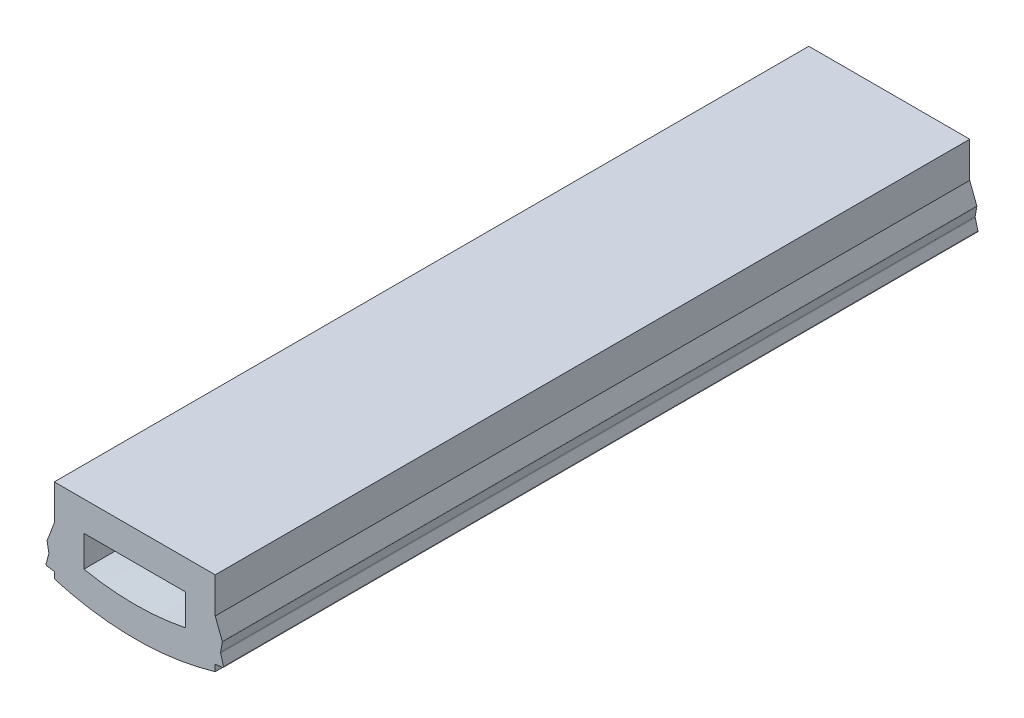
ISO-10303-21;
HEADER;
FILE_DESCRIPTION(('STEP AP214'),'2;1');
FILE_NAME('part.step','',(''),(''),'','','');
FILE_SCHEMA(('AUTOMOTIVE_DESIGN { 1 0 10303 214 1 1 1 1 }'));
ENDSEC;
DATA;
#1=APPLICATION_CONTEXT('core data for automotive mechanical design processes');
#2=APPLICATION_PROTOCOL_DEFINITION('international standard','automotive_design',2000,#1);
#3=PRODUCT_CONTEXT('',#1,'mechanical');
#4=PRODUCT('Part','Part','',(#3));
#5=PRODUCT_RELATED_PRODUCT_CATEGORY('part','',(#4));
#6=PRODUCT_DEFINITION_FORMATION('','',#4);
#7=PRODUCT_DEFINITION_CONTEXT('part definition',#1,'design');
#8=PRODUCT_DEFINITION('design','',#6,#7);
#9=PRODUCT_DEFINITION_SHAPE('','',#8);
#10=(LENGTH_UNIT() NAMED_UNIT(*) SI_UNIT(.MILLI.,.METRE.));
#11=(NAMED_UNIT(*) PLANE_ANGLE_UNIT() SI_UNIT($,.RADIAN.));
#12=(NAMED_UNIT(*) SI_UNIT($,.STERADIAN.) SOLID_ANGLE_UNIT());
#13=UNCERTAINTY_MEASURE_WITH_UNIT(LENGTH_MEASURE(1.E-05),#10,'distance_accuracy_value','');
#14=(GEOMETRIC_REPRESENTATION_CONTEXT(3) GLOBAL_UNCERTAINTY_ASSIGNED_CONTEXT((#13)) GLOBAL_UNIT_ASSIGNED_CONTEXT((#10,
#11,#12)) REPRESENTATION_CONTEXT('',''));
#15=CARTESIAN_POINT('',(0.,0.,0.));
#16=DIRECTION('',(0.,0.,1.));
#17=DIRECTION('',(1.,0.,0.));
#18=AXIS2_PLACEMENT_3D('',#15,#16,#17);
#19=CARTESIAN_POINT('',(-15.9576717718248,-92.1739103346942,-150.));
#20=DIRECTION('',(1.,0.,0.));
#21=DIRECTION('',(0.,0.,-1.));
#22=AXIS2_PLACEMENT_3D('',#19,#20,#21);
#23=PLANE('',#22);
#24=DIRECTION('',(0.,0.,-1.));
#25=VECTOR('',#24,1.);
#26=CARTESIAN_POINT('',(-15.9576717718248,-82.5706933548295,8.48348129526422));
#27=LINE('',#26,#25);
#28=CARTESIAN_POINT('',(-15.9576717718248,-82.5706933548295,0.));
#29=VERTEX_POINT('',#28);
#30=CARTESIAN_POINT('',(-15.9576717718248,-82.5706933548295,-150.));
#31=VERTEX_POINT('',#30);
#32=EDGE_CURVE('E247',#29,#31,#27,.T.);
#33=ORIENTED_EDGE('',*,*,#32,.F.);
#34=DIRECTION('',(0.,1.,0.));
#35=VECTOR('',#34,1.);
#36=CARTESIAN_POINT('',(-15.9576717718248,-92.1739103346942,0.));
#37=LINE('',#36,#35);
#38=CARTESIAN_POINT('',(-15.9576717718248,-75.4867347301291,0.));
#39=VERTEX_POINT('',#38);
#40=EDGE_CURVE('E454',#29,#39,#37,.T.);
#41=ORIENTED_EDGE('',*,*,#40,.T.);
#42=DIRECTION('',(0.,0.,1.));
#43=VECTOR('',#42,1.);
#44=CARTESIAN_POINT('',(-15.9576717718248,-75.4867347301291,-150.));
#45=LINE('',#44,#43);
#46=CARTESIAN_POINT('',(-15.9576717718248,-75.4867347301291,-150.));
#47=VERTEX_POINT('',#46);
#48=EDGE_CURVE('E50',#47,#39,#45,.T.);
#49=ORIENTED_EDGE('',*,*,#48,.F.);
#50=DIRECTION('',(0.,1.,0.));
#51=VECTOR('',#50,1.);
#52=CARTESIAN_POINT('',(-15.9576717718248,-92.1739103346942,-150.));
#53=LINE('',#52,#51);
#54=EDGE_CURVE('E456',#31,#47,#53,.T.);
#55=ORIENTED_EDGE('',*,*,#54,.F.);
#56=EDGE_LOOP('',(#33,#41,#49,#55));
#57=FACE_BOUND('',#56,.T.);
#58=ADVANCED_FACE('F41',(#57),#23,.F.);
#59=CARTESIAN_POINT('',(16.0423282281753,-75.4867347301291,-150.));
#60=DIRECTION('',(-1.,0.,0.));
#61=DIRECTION('',(0.,0.,1.));
#62=AXIS2_PLACEMENT_3D('',#59,#60,#61);
#63=PLANE('',#62);
#64=DIRECTION('',(0.,0.,-1.));
#65=VECTOR('',#64,1.);
#66=CARTESIAN_POINT('',(16.0423282281753,-90.8939103346942,8.48348129526422));
#67=LINE('',#66,#65);
#68=CARTESIAN_POINT('',(16.0423282281753,-90.8939103346943,0.));
#69=VERTEX_POINT('',#68);
#70=CARTESIAN_POINT('',(16.0423282281753,-90.8939103346942,-150.));
#71=VERTEX_POINT('',#70);
#72=EDGE_CURVE('E344',#69,#71,#67,.T.);
#73=ORIENTED_EDGE('',*,*,#72,.F.);
#74=DIRECTION('',(0.,-1.,0.));
#75=VECTOR('',#74,1.);
#76=CARTESIAN_POINT('',(16.0423282281753,-75.4867347301291,0.));
#77=LINE('',#76,#75);
#78=CARTESIAN_POINT('',(16.0423282281753,-92.1739103346944,0.));
#79=VERTEX_POINT('',#78);
#80=EDGE_CURVE('E475',#69,#79,#77,.T.);
#81=ORIENTED_EDGE('',*,*,#80,.T.);
#82=DIRECTION('',(0.,0.,1.));
#83=VECTOR('',#82,1.);
#84=CARTESIAN_POINT('',(16.0423282281753,-92.1739103346944,-150.));
#85=LINE('',#84,#83);
#86=CARTESIAN_POINT('',(16.0423282281753,-92.1739103346944,-150.));
#87=VERTEX_POINT('',#86);
#88=EDGE_CURVE('E481',#87,#79,#85,.T.);
#89=ORIENTED_EDGE('',*,*,#88,.F.);
#90=DIRECTION('',(0.,-1.,0.));
#91=VECTOR('',#90,1.);
#92=CARTESIAN_POINT('',(16.0423282281753,-75.4867347301291,-150.));
#93=LINE('',#92,#91);
#94=EDGE_CURVE('E496',#71,#87,#93,.T.);
#95=ORIENTED_EDGE('',*,*,#94,.F.);
#96=EDGE_LOOP('',(#73,#81,#89,#95));
#97=FACE_BOUND('',#96,.T.);
#98=ADVANCED_FACE('F432',(#97),#63,.F.);
#99=CARTESIAN_POINT('',(0.0423282281755821,-37.986734730129,-150.));
#100=DIRECTION('',(0.,0.,1.));
#101=DIRECTION('',(1.,0.,0.));
#102=AXIS2_PLACEMENT_3D('',#99,#100,#101);
#103=CYLINDRICAL_SURFACE('',#102,56.5);
#104=CARTESIAN_POINT('',(0.0423282281755821,-37.986734730129,0.));
#105=DIRECTION('',(0.,0.,-1.));
#106=DIRECTION('',(-1.,0.,0.));
#107=AXIS2_PLACEMENT_3D('',#104,#105,#106);
#108=CIRCLE('',#107,56.5);
#109=CARTESIAN_POINT('',(-15.9576717718248,-92.1739103346942,0.));
#110=VERTEX_POINT('',#109);
#111=EDGE_CURVE('E382',#79,#110,#108,.T.);
#112=ORIENTED_EDGE('',*,*,#111,.T.);
#113=DIRECTION('',(0.,0.,1.));
#114=VECTOR('',#113,1.);
#115=CARTESIAN_POINT('',(-15.9576717718248,-92.1739103346942,-150.));
#116=LINE('',#115,#114);
#117=CARTESIAN_POINT('',(-15.9576717718248,-92.1739103346942,-150.));
#118=VERTEX_POINT('',#117);
#119=EDGE_CURVE('E11',#118,#110,#116,.T.);
#120=ORIENTED_EDGE('',*,*,#119,.F.);
#121=CARTESIAN_POINT('',(0.0423282281755821,-37.986734730129,-150.));
#122=DIRECTION('',(0.,0.,-1.));
#123=DIRECTION('',(-1.,0.,0.));
#124=AXIS2_PLACEMENT_3D('',#121,#122,#123);
#125=CIRCLE('',#124,56.5);
#126=EDGE_CURVE('E480',#87,#118,#125,.T.);
#127=ORIENTED_EDGE('',*,*,#126,.F.);
#128=ORIENTED_EDGE('',*,*,#88,.T.);
#129=EDGE_LOOP('',(#112,#120,#127,#128));
#130=FACE_BOUND('',#129,.T.);
#131=ADVANCED_FACE('F43',(#130),#103,.T.);
#132=CARTESIAN_POINT('',(-15.9576717718248,-90.8939103346942,0.));
#133=VERTEX_POINT('',#132);
#134=EDGE_CURVE('E465',#110,#133,#37,.T.);
#135=ORIENTED_EDGE('',*,*,#134,.T.);
#136=DIRECTION('',(0.,0.,-1.));
#137=VECTOR('',#136,1.);
#138=CARTESIAN_POINT('',(-15.9576717718248,-90.8939103346942,8.48348129526422));
#139=LINE('',#138,#137);
#140=CARTESIAN_POINT('',(-15.9576717718248,-90.8939103346942,-150.));
#141=VERTEX_POINT('',#140);
#142=EDGE_CURVE('E225',#133,#141,#139,.T.);
#143=ORIENTED_EDGE('',*,*,#142,.T.);
#144=EDGE_CURVE('E497',#118,#141,#53,.T.);
#145=ORIENTED_EDGE('',*,*,#144,.F.);
#146=ORIENTED_EDGE('',*,*,#119,.T.);
#147=EDGE_LOOP('',(#135,#143,#145,#146));
#148=FACE_BOUND('',#147,.T.);
#149=ADVANCED_FACE('F434',(#148),#23,.F.);
#150=CARTESIAN_POINT('',(16.0423282281753,-75.4867347301291,-150.));
#151=DIRECTION('',(0.,1.,0.));
#152=DIRECTION('',(0.,0.,1.));
#153=AXIS2_PLACEMENT_3D('',#150,#151,#152);
#154=PLANE('',#153);
#155=DIRECTION('',(-1.,0.,0.));
#156=VECTOR('',#155,1.);
#157=CARTESIAN_POINT('',(16.0423282281753,-75.4867347301291,0.));
#158=LINE('',#157,#156);
#159=CARTESIAN_POINT('',(16.0423282281753,-75.4867347301291,0.));
#160=VERTEX_POINT('',#159);
#161=EDGE_CURVE('E463',#160,#39,#158,.T.);
#162=ORIENTED_EDGE('',*,*,#161,.F.);
#163=DIRECTION('',(0.,0.,1.));
#164=VECTOR('',#163,1.);
#165=CARTESIAN_POINT('',(16.0423282281753,-75.4867347301291,-150.));
#166=LINE('',#165,#164);
#167=CARTESIAN_POINT('',(16.0423282281753,-75.4867347301291,-150.));
#168=VERTEX_POINT('',#167);
#169=EDGE_CURVE('E485',#168,#160,#166,.T.);
#170=ORIENTED_EDGE('',*,*,#169,.F.);
#171=DIRECTION('',(-1.,0.,0.));
#172=VECTOR('',#171,1.);
#173=CARTESIAN_POINT('',(16.0423282281753,-75.4867347301291,-150.));
#174=LINE('',#173,#172);
#175=EDGE_CURVE('E491',#168,#47,#174,.T.);
#176=ORIENTED_EDGE('',*,*,#175,.T.);
#177=ORIENTED_EDGE('',*,*,#48,.T.);
#178=EDGE_LOOP('',(#162,#170,#176,#177));
#179=FACE_BOUND('',#178,.T.);
#180=ADVANCED_FACE('F430',(#179),#154,.T.);
#181=CARTESIAN_POINT('',(16.0423282281753,-82.5706933548294,0.));
#182=VERTEX_POINT('',#181);
#183=EDGE_CURVE('E476',#160,#182,#77,.T.);
#184=ORIENTED_EDGE('',*,*,#183,.T.);
#185=DIRECTION('',(0.,0.,-1.));
#186=VECTOR('',#185,1.);
#187=CARTESIAN_POINT('',(16.0423282281753,-82.5706933548294,8.48348129526422));
#188=LINE('',#187,#186);
#189=CARTESIAN_POINT('',(16.0423282281753,-82.5706933548294,-150.));
#190=VERTEX_POINT('',#189);
#191=EDGE_CURVE('E341',#182,#190,#188,.T.);
#192=ORIENTED_EDGE('',*,*,#191,.T.);
#193=EDGE_CURVE('E486',#168,#190,#93,.T.);
#194=ORIENTED_EDGE('',*,*,#193,.F.);
#195=ORIENTED_EDGE('',*,*,#169,.T.);
#196=EDGE_LOOP('',(#184,#192,#194,#195));
#197=FACE_BOUND('',#196,.T.);
#198=ADVANCED_FACE('F423',(#197),#63,.F.);
#199=CARTESIAN_POINT('',(0.0423282281755821,-37.986734730129,-150.));
#200=DIRECTION('',(0.,0.,-1.));
#201=DIRECTION('',(-1.,0.,0.));
#202=AXIS2_PLACEMENT_3D('',#199,#200,#201);
#203=PLANE('',#202);
#204=DIRECTION('',(0.,-1.,0.));
#205=VECTOR('',#204,1.);
#206=CARTESIAN_POINT('',(-12.02127933455,-37.986734730129,-150.));
#207=LINE('',#206,#205);
#208=CARTESIAN_POINT('',(-12.02127933455,-79.4231271674038,-150.));
#209=VERTEX_POINT('',#208);
#210=CARTESIAN_POINT('',(-12.02127933455,-89.1472880166284,-150.));
#211=VERTEX_POINT('',#210);
#212=EDGE_CURVE('E378',#209,#211,#207,.T.);
#213=ORIENTED_EDGE('',*,*,#212,.T.);
#214=CARTESIAN_POINT('',(0.0423282281755821,-37.986734730129,-150.));
#215=DIRECTION('',(0.,0.,1.));
#216=DIRECTION('',(1.,0.,0.));
#217=AXIS2_PLACEMENT_3D('',#214,#215,#216);
#218=CIRCLE('',#217,52.5636075627253);
#219=CARTESIAN_POINT('',(12.1059357909005,-89.1472880166285,-150.));
#220=VERTEX_POINT('',#219);
#221=EDGE_CURVE('E758',#211,#220,#218,.T.);
#222=ORIENTED_EDGE('',*,*,#221,.T.);
#223=DIRECTION('',(0.,1.,0.));
#224=VECTOR('',#223,1.);
#225=CARTESIAN_POINT('',(12.1059357909005,-37.986734730129,-150.));
#226=LINE('',#225,#224);
#227=CARTESIAN_POINT('',(12.1059357909005,-79.4231271674038,-150.));
#228=VERTEX_POINT('',#227);
#229=EDGE_CURVE('E762',#220,#228,#226,.T.);
#230=ORIENTED_EDGE('',*,*,#229,.T.);
#231=DIRECTION('',(-1.,0.,0.));
#232=VECTOR('',#231,1.);
#233=CARTESIAN_POINT('',(0.0423282281755821,-79.4231271674038,-150.));
#234=LINE('',#233,#232);
#235=EDGE_CURVE('E395',#228,#209,#234,.T.);
#236=ORIENTED_EDGE('',*,*,#235,.T.);
#237=EDGE_LOOP('',(#213,#222,#230,#236));
#238=FACE_BOUND('',#237,.T.);
#239=ORIENTED_EDGE('',*,*,#126,.T.);
#240=ORIENTED_EDGE('',*,*,#144,.T.);
#241=DIRECTION('',(-0.991444861373816,0.130526192220007,0.));
#242=VECTOR('',#241,1.);
#243=CARTESIAN_POINT('',(-15.9576717718248,-90.8939103346942,-150.));
#244=LINE('',#243,#242);
#245=CARTESIAN_POINT('',(-17.4249698670615,-90.7007368757512,-150.));
#246=VERTEX_POINT('',#245);
#247=EDGE_CURVE('E57',#141,#246,#244,.T.);
#248=ORIENTED_EDGE('',*,*,#247,.T.);
#249=CARTESIAN_POINT('',(-17.3988646286175,-90.5024479034764,-150.));
#250=DIRECTION('',(0.,0.,-1.));
#251=DIRECTION('',(-1.,0.,0.));
#252=AXIS2_PLACEMENT_3D('',#249,#250,#251);
#253=CIRCLE('',#252,0.200000000000005);
#254=CARTESIAN_POINT('',(-17.5920497938754,-90.4506840944559,-150.));
#255=VERTEX_POINT('',#254);
#256=EDGE_CURVE('E269',#246,#255,#253,.T.);
#257=ORIENTED_EDGE('',*,*,#256,.T.);
#258=DIRECTION('',(0.258819045102518,0.965925826289069,0.));
#259=VECTOR('',#258,1.);
#260=CARTESIAN_POINT('',(-17.5920497938754,-90.4506840944559,-150.));
#261=LINE('',#260,#259);
#262=CARTESIAN_POINT('',(-17.0491756392839,-88.4246501674047,-150.));
#263=VERTEX_POINT('',#262);
#264=EDGE_CURVE('E266',#255,#263,#261,.T.);
#265=ORIENTED_EDGE('',*,*,#264,.T.);
#266=CARTESIAN_POINT('',(-17.4355459697996,-88.3211225493637,-150.));
#267=DIRECTION('',(0.,0.,-1.));
#268=DIRECTION('',(-1.,0.,0.));
#269=AXIS2_PLACEMENT_3D('',#266,#267,#268);
#270=CIRCLE('',#269,0.400000000000011);
#271=CARTESIAN_POINT('',(-17.0415547754991,-88.2520505665222,-150.));
#272=VERTEX_POINT('',#271);
#273=EDGE_CURVE('E229',#272,#263,#270,.T.);
#274=ORIENTED_EDGE('',*,*,#273,.F.);
#275=DIRECTION('',(-0.172679957103787,0.984977985751273,0.));
#276=VECTOR('',#275,1.);
#277=CARTESIAN_POINT('',(-17.0415547754991,-88.2520505665222,-150.));
#278=LINE('',#277,#276);
#279=CARTESIAN_POINT('',(-17.3733117042244,-86.3596869309526,-150.));
#280=VERTEX_POINT('',#279);
#281=EDGE_CURVE('E260',#272,#280,#278,.T.);
#282=ORIENTED_EDGE('',*,*,#281,.T.);
#283=CARTESIAN_POINT('',(-17.1763161070741,-86.3251509395318,-150.));
#284=DIRECTION('',(0.,0.,-1.));
#285=DIRECTION('',(-1.,0.,0.));
#286=AXIS2_PLACEMENT_3D('',#283,#284,#285);
#287=CIRCLE('',#286,0.200000000000006);
#288=CARTESIAN_POINT('',(-17.3631731897636,-86.2538457458305,-150.));
#289=VERTEX_POINT('',#288);
#290=EDGE_CURVE('E256',#280,#289,#287,.T.);
#291=ORIENTED_EDGE('',*,*,#290,.T.);
#292=DIRECTION('',(0.356525968506781,0.934285413447251,0.));
#293=VECTOR('',#292,1.);
#294=CARTESIAN_POINT('',(-17.3631731897636,-86.2538457458305,-150.));
#295=LINE('',#294,#293);
#296=EDGE_CURVE('E252',#289,#31,#295,.T.);
#297=ORIENTED_EDGE('',*,*,#296,.T.);
#298=ORIENTED_EDGE('',*,*,#54,.T.);
#299=ORIENTED_EDGE('',*,*,#175,.F.);
#300=ORIENTED_EDGE('',*,*,#193,.T.);
#301=DIRECTION('',(-0.356525968506777,0.934285413447253,0.));
#302=VECTOR('',#301,1.);
#303=CARTESIAN_POINT('',(-13.5008756311206,-5.15197250304345,-150.));
#304=LINE('',#303,#302);
#305=CARTESIAN_POINT('',(17.4478296461141,-86.2538457458305,-150.));
#306=VERTEX_POINT('',#305);
#307=EDGE_CURVE('E65',#306,#190,#304,.T.);
#308=ORIENTED_EDGE('',*,*,#307,.F.);
#309=CARTESIAN_POINT('',(17.2609725634247,-86.3251509395318,-150.));
#310=DIRECTION('',(0.,0.,-1.));
#311=DIRECTION('',(-1.,0.,0.));
#312=AXIS2_PLACEMENT_3D('',#309,#310,#311);
#313=CIRCLE('',#312,0.200000000000006);
#314=CARTESIAN_POINT('',(17.457968160575,-86.3596869309526,-150.));
#315=VERTEX_POINT('',#314);
#316=EDGE_CURVE('E275',#315,#306,#313,.F.);
#317=ORIENTED_EDGE('',*,*,#316,.F.);
#318=DIRECTION('',(0.172679957103794,0.984977985751272,0.));
#319=VECTOR('',#318,1.);
#320=CARTESIAN_POINT('',(31.6259699884821,-5.54446009959457,-150.));
#321=LINE('',#320,#319);
#322=CARTESIAN_POINT('',(17.1262112318496,-88.2520505665222,-150.));
#323=VERTEX_POINT('',#322);
#324=EDGE_CURVE('E315',#323,#315,#321,.T.);
#325=ORIENTED_EDGE('',*,*,#324,.F.);
#326=CARTESIAN_POINT('',(17.5202024261501,-88.3211225493637,-150.));
#327=DIRECTION('',(0.,0.,-1.));
#328=DIRECTION('',(-1.,0.,0.));
#329=AXIS2_PLACEMENT_3D('',#326,#327,#328);
#330=CIRCLE('',#329,0.400000000000014);
#331=CARTESIAN_POINT('',(17.1338320956345,-88.4246501674047,-150.));
#332=VERTEX_POINT('',#331);
#333=EDGE_CURVE('E319',#323,#332,#330,.F.);
#334=ORIENTED_EDGE('',*,*,#333,.T.);
#335=DIRECTION('',(-0.258819045102512,0.965925826289071,0.));
#336=VECTOR('',#335,1.);
#337=CARTESIAN_POINT('',(-6.12007956453486,-1.63987037693128,-150.));
#338=LINE('',#337,#336);
#339=CARTESIAN_POINT('',(17.6767062502259,-90.4506840944559,-150.));
#340=VERTEX_POINT('',#339);
#341=EDGE_CURVE('E323',#340,#332,#338,.T.);
#342=ORIENTED_EDGE('',*,*,#341,.F.);
#343=CARTESIAN_POINT('',(17.4835210849681,-90.5024479034764,-150.));
#344=DIRECTION('',(0.,0.,-1.));
#345=DIRECTION('',(-1.,0.,0.));
#346=AXIS2_PLACEMENT_3D('',#343,#344,#345);
#347=CIRCLE('',#346,0.200000000000005);
#348=CARTESIAN_POINT('',(17.5096263234121,-90.7007368757512,-150.));
#349=VERTEX_POINT('',#348);
#350=EDGE_CURVE('E327',#349,#340,#347,.F.);
#351=ORIENTED_EDGE('',*,*,#350,.F.);
#352=DIRECTION('',(0.991444861373816,0.130526192220007,0.));
#353=VECTOR('',#352,1.);
#354=CARTESIAN_POINT('',(12.035852078613,-91.4213729263083,-150.));
#355=LINE('',#354,#353);
#356=EDGE_CURVE('E331',#71,#349,#355,.T.);
#357=ORIENTED_EDGE('',*,*,#356,.F.);
#358=ORIENTED_EDGE('',*,*,#94,.T.);
#359=EDGE_LOOP('',(#239,#240,#248,#257,#265,#274,#282,#291,#297,#298,#299,#300,#308,#317,#325,
#334,#342,#351,#357,#358));
#360=FACE_BOUND('',#359,.T.);
#361=ADVANCED_FACE('F420',(#238,#360),#203,.T.);
#362=CARTESIAN_POINT('',(0.0423282281755821,-37.986734730129,0.));
#363=DIRECTION('',(0.,0.,-1.));
#364=DIRECTION('',(-1.,0.,0.));
#365=AXIS2_PLACEMENT_3D('',#362,#363,#364);
#366=PLANE('',#365);
#367=CARTESIAN_POINT('',(0.0423282281755821,-37.986734730129,0.));
#368=DIRECTION('',(0.,0.,1.));
#369=DIRECTION('',(1.,0.,0.));
#370=AXIS2_PLACEMENT_3D('',#367,#368,#369);
#371=CIRCLE('',#370,50.6);
#372=CARTESIAN_POINT('',(-10.0576717718248,-87.5684854051505,0.));
#373=VERTEX_POINT('',#372);
#374=CARTESIAN_POINT('',(10.1423282281753,-87.5684854051506,0.));
#375=VERTEX_POINT('',#374);
#376=EDGE_CURVE('E366',#373,#375,#371,.T.);
#377=ORIENTED_EDGE('',*,*,#376,.F.);
#378=DIRECTION('',(0.,-1.,0.));
#379=VECTOR('',#378,1.);
#380=CARTESIAN_POINT('',(-10.0576717718248,-81.3867347301291,0.));
#381=LINE('',#380,#379);
#382=CARTESIAN_POINT('',(-10.0576717718248,-81.3867347301291,0.));
#383=VERTEX_POINT('',#382);
#384=EDGE_CURVE('E311',#383,#373,#381,.T.);
#385=ORIENTED_EDGE('',*,*,#384,.F.);
#386=DIRECTION('',(-1.,0.,0.));
#387=VECTOR('',#386,1.);
#388=CARTESIAN_POINT('',(10.1423282281753,-81.3867347301291,0.));
#389=LINE('',#388,#387);
#390=CARTESIAN_POINT('',(10.1423282281753,-81.3867347301291,0.));
#391=VERTEX_POINT('',#390);
#392=EDGE_CURVE('E374',#391,#383,#389,.T.);
#393=ORIENTED_EDGE('',*,*,#392,.F.);
#394=DIRECTION('',(0.,1.,0.));
#395=VECTOR('',#394,1.);
#396=CARTESIAN_POINT('',(10.1423282281753,-87.5684854051506,0.));
#397=LINE('',#396,#395);
#398=EDGE_CURVE('E370',#375,#391,#397,.T.);
#399=ORIENTED_EDGE('',*,*,#398,.F.);
#400=EDGE_LOOP('',(#377,#385,#393,#399));
#401=FACE_BOUND('',#400,.T.);
#402=ORIENTED_EDGE('',*,*,#111,.F.);
#403=ORIENTED_EDGE('',*,*,#80,.F.);
#404=DIRECTION('',(-0.991444861373816,-0.130526192220007,0.));
#405=VECTOR('',#404,1.);
#406=CARTESIAN_POINT('',(12.035852078613,-91.4213729263083,0.));
#407=LINE('',#406,#405);
#408=CARTESIAN_POINT('',(17.5096263234121,-90.7007368757512,0.));
#409=VERTEX_POINT('',#408);
#410=EDGE_CURVE('E300',#409,#69,#407,.T.);
#411=ORIENTED_EDGE('',*,*,#410,.F.);
#412=CARTESIAN_POINT('',(17.4835210849681,-90.5024479034764,0.));
#413=DIRECTION('',(0.,0.,-1.));
#414=DIRECTION('',(-1.,0.,0.));
#415=AXIS2_PLACEMENT_3D('',#412,#413,#414);
#416=CIRCLE('',#415,0.200000000000005);
#417=CARTESIAN_POINT('',(17.6767062502259,-90.4506840944559,0.));
#418=VERTEX_POINT('',#417);
#419=EDGE_CURVE('E296',#418,#409,#416,.T.);
#420=ORIENTED_EDGE('',*,*,#419,.F.);
#421=DIRECTION('',(0.258819045102512,-0.965925826289071,0.));
#422=VECTOR('',#421,1.);
#423=CARTESIAN_POINT('',(-6.12007956453486,-1.63987037693128,0.));
#424=LINE('',#423,#422);
#425=CARTESIAN_POINT('',(17.1338320956345,-88.4246501674047,0.));
#426=VERTEX_POINT('',#425);
#427=EDGE_CURVE('E291',#426,#418,#424,.T.);
#428=ORIENTED_EDGE('',*,*,#427,.F.);
#429=CARTESIAN_POINT('',(17.5202024261501,-88.3211225493637,0.));
#430=DIRECTION('',(0.,0.,-1.));
#431=DIRECTION('',(-1.,0.,0.));
#432=AXIS2_PLACEMENT_3D('',#429,#430,#431);
#433=CIRCLE('',#432,0.400000000000014);
#434=CARTESIAN_POINT('',(17.1262112318496,-88.2520505665222,0.));
#435=VERTEX_POINT('',#434);
#436=EDGE_CURVE('E288',#426,#435,#433,.T.);
#437=ORIENTED_EDGE('',*,*,#436,.T.);
#438=DIRECTION('',(-0.172679957103794,-0.984977985751271,0.));
#439=VECTOR('',#438,1.);
#440=CARTESIAN_POINT('',(31.6259699884821,-5.54446009959457,0.));
#441=LINE('',#440,#439);
#442=CARTESIAN_POINT('',(17.457968160575,-86.3596869309526,0.));
#443=VERTEX_POINT('',#442);
#444=EDGE_CURVE('E292',#443,#435,#441,.T.);
#445=ORIENTED_EDGE('',*,*,#444,.F.);
#446=CARTESIAN_POINT('',(17.2609725634247,-86.3251509395318,0.));
#447=DIRECTION('',(0.,0.,-1.));
#448=DIRECTION('',(-1.,0.,0.));
#449=AXIS2_PLACEMENT_3D('',#446,#447,#448);
#450=CIRCLE('',#449,0.200000000000006);
#451=CARTESIAN_POINT('',(17.4478296461141,-86.2538457458305,0.));
#452=VERTEX_POINT('',#451);
#453=EDGE_CURVE('E307',#452,#443,#450,.T.);
#454=ORIENTED_EDGE('',*,*,#453,.F.);
#455=DIRECTION('',(0.356525968506777,-0.934285413447253,0.));
#456=VECTOR('',#455,1.);
#457=CARTESIAN_POINT('',(-13.5008756311206,-5.15197250304345,0.));
#458=LINE('',#457,#456);
#459=EDGE_CURVE('E303',#182,#452,#458,.T.);
#460=ORIENTED_EDGE('',*,*,#459,.F.);
#461=ORIENTED_EDGE('',*,*,#183,.F.);
#462=ORIENTED_EDGE('',*,*,#161,.T.);
#463=ORIENTED_EDGE('',*,*,#40,.F.);
#464=DIRECTION('',(-0.356525968506781,-0.934285413447251,0.));
#465=VECTOR('',#464,1.);
#466=CARTESIAN_POINT('',(-17.3631731897636,-86.2538457458305,0.));
#467=LINE('',#466,#465);
#468=CARTESIAN_POINT('',(-17.3631731897636,-86.2538457458305,0.));
#469=VERTEX_POINT('',#468);
#470=EDGE_CURVE('E279',#29,#469,#467,.T.);
#471=ORIENTED_EDGE('',*,*,#470,.T.);
#472=CARTESIAN_POINT('',(-17.1763161070741,-86.3251509395318,0.));
#473=DIRECTION('',(0.,0.,-1.));
#474=DIRECTION('',(-1.,0.,0.));
#475=AXIS2_PLACEMENT_3D('',#472,#473,#474);
#476=CIRCLE('',#475,0.200000000000006);
#477=CARTESIAN_POINT('',(-17.3733117042244,-86.3596869309526,0.));
#478=VERTEX_POINT('',#477);
#479=EDGE_CURVE('E283',#469,#478,#476,.F.);
#480=ORIENTED_EDGE('',*,*,#479,.T.);
#481=DIRECTION('',(0.172679957103787,-0.984977985751273,0.));
#482=VECTOR('',#481,1.);
#483=CARTESIAN_POINT('',(-17.0415547754991,-88.2520505665222,0.));
#484=LINE('',#483,#482);
#485=CARTESIAN_POINT('',(-17.0415547754991,-88.2520505665222,0.));
#486=VERTEX_POINT('',#485);
#487=EDGE_CURVE('E211',#478,#486,#484,.T.);
#488=ORIENTED_EDGE('',*,*,#487,.T.);
#489=CARTESIAN_POINT('',(-17.4355459697996,-88.3211225493637,0.));
#490=DIRECTION('',(0.,0.,-1.));
#491=DIRECTION('',(-1.,0.,0.));
#492=AXIS2_PLACEMENT_3D('',#489,#490,#491);
#493=CIRCLE('',#492,0.400000000000011);
#494=CARTESIAN_POINT('',(-17.0491756392839,-88.4246501674047,0.));
#495=VERTEX_POINT('',#494);
#496=EDGE_CURVE('E204',#495,#486,#493,.F.);
#497=ORIENTED_EDGE('',*,*,#496,.F.);
#498=DIRECTION('',(-0.258819045102518,-0.965925826289069,0.));
#499=VECTOR('',#498,1.);
#500=CARTESIAN_POINT('',(-17.5920497938754,-90.4506840944559,0.));
#501=LINE('',#500,#499);
#502=CARTESIAN_POINT('',(-17.5920497938754,-90.4506840944559,0.));
#503=VERTEX_POINT('',#502);
#504=EDGE_CURVE('E208',#495,#503,#501,.T.);
#505=ORIENTED_EDGE('',*,*,#504,.T.);
#506=CARTESIAN_POINT('',(-17.3988646286175,-90.5024479034764,0.));
#507=DIRECTION('',(0.,0.,-1.));
#508=DIRECTION('',(-1.,0.,0.));
#509=AXIS2_PLACEMENT_3D('',#506,#507,#508);
#510=CIRCLE('',#509,0.200000000000005);
#511=CARTESIAN_POINT('',(-17.4249698670615,-90.7007368757512,0.));
#512=VERTEX_POINT('',#511);
#513=EDGE_CURVE('E280',#503,#512,#510,.F.);
#514=ORIENTED_EDGE('',*,*,#513,.T.);
#515=DIRECTION('',(0.991444861373816,-0.130526192220007,0.));
#516=VECTOR('',#515,1.);
#517=CARTESIAN_POINT('',(-15.9576717718248,-90.8939103346942,0.));
#518=LINE('',#517,#516);
#519=EDGE_CURVE('E276',#512,#133,#518,.T.);
#520=ORIENTED_EDGE('',*,*,#519,.T.);
#521=ORIENTED_EDGE('',*,*,#134,.F.);
#522=EDGE_LOOP('',(#402,#403,#411,#420,#428,#437,#445,#454,#460,#461,#462,#463,#471,#480,#488,
#497,#505,#514,#520,#521));
#523=FACE_BOUND('',#522,.T.);
#524=ADVANCED_FACE('F207',(#401,#523),#366,.F.);
#525=CARTESIAN_POINT('',(-10.0576717718248,-81.3867347301291,0.));
#526=DIRECTION('',(-0.999914327574007,0.,0.0130895955713445));
#527=DIRECTION('',(0.0130895955713445,0.,0.999914327574007));
#528=AXIS2_PLACEMENT_3D('',#525,#526,#527);
#529=PLANE('',#528);
#530=ORIENTED_EDGE('',*,*,#384,.T.);
#531=CARTESIAN_POINT('',(-12.02127933455,-89.1472880166284,-150.));
#532=CARTESIAN_POINT('',(-11.7949092809625,-88.9680868825866,-132.707589498686));
#533=CARTESIAN_POINT('',(-11.5685393547174,-88.7879458237444,-115.415188725064));
#534=CARTESIAN_POINT('',(-11.1157997708988,-88.4257196274306,-80.8304077016358));
#535=CARTESIAN_POINT('',(-10.8894301133252,-88.2436344899774,-63.5380274518303));
#536=CARTESIAN_POINT('',(-10.4612642085633,-87.8973308297576,-30.8304300003614));
#537=CARTESIAN_POINT('',(-10.2594679327995,-87.7333184827905,-15.4152106158133));
#538=CARTESIAN_POINT('',(-10.0576717718248,-87.5684854051505,0.));
#539=B_SPLINE_CURVE_WITH_KNOTS('',3,(#531,#532,#533,#534,#535,#536,#537,#538),.UNSPECIFIED.,.F.,
.F.,(4,2,2,4),(0.,51.8844616022929,103.768922710607,150.021160352912),.UNSPECIFIED.);
#540=EDGE_CURVE('E384',#211,#373,#539,.T.);
#541=ORIENTED_EDGE('',*,*,#540,.F.);
#542=ORIENTED_EDGE('',*,*,#212,.F.);
#543=DIRECTION('',(0.0130884743460528,-0.0130884743460528,0.999828677163535));
#544=VECTOR('',#543,1.);
#545=CARTESIAN_POINT('',(-10.0542113469785,-81.3901951549754,0.264341886228357));
#546=LINE('',#545,#544);
#547=EDGE_CURVE('E379',#209,#383,#546,.T.);
#548=ORIENTED_EDGE('',*,*,#547,.T.);
#549=EDGE_LOOP('',(#530,#541,#542,#548));
#550=FACE_BOUND('',#549,.T.);
#551=ADVANCED_FACE('F402',(#550),#529,.F.);
#552=CARTESIAN_POINT('',(10.1423282281753,-81.3867347301291,0.));
#553=DIRECTION('',(0.,0.999914327574007,0.0130895955713445));
#554=DIRECTION('',(0.,-0.0130895955713445,0.999914327574007));
#555=AXIS2_PLACEMENT_3D('',#552,#553,#554);
#556=PLANE('',#555);
#557=ORIENTED_EDGE('',*,*,#392,.T.);
#558=ORIENTED_EDGE('',*,*,#547,.F.);
#559=ORIENTED_EDGE('',*,*,#235,.F.);
#560=DIRECTION('',(-0.0130884743460528,-0.0130884743460528,0.999828677163536));
#561=VECTOR('',#560,1.);
#562=CARTESIAN_POINT('',(10.1412692438372,-81.3877937144672,0.0808958234469614));
#563=LINE('',#562,#561);
#564=EDGE_CURVE('E383',#228,#391,#563,.T.);
#565=ORIENTED_EDGE('',*,*,#564,.T.);
#566=EDGE_LOOP('',(#557,#558,#559,#565));
#567=FACE_BOUND('',#566,.T.);
#568=ADVANCED_FACE('F415',(#567),#556,.F.);
#569=CARTESIAN_POINT('',(10.1423282281753,-87.5684854051506,0.));
#570=DIRECTION('',(0.999914327574007,0.,0.0130895955713445));
#571=DIRECTION('',(0.0130895955713445,0.,-0.999914327574007));
#572=AXIS2_PLACEMENT_3D('',#569,#570,#571);
#573=PLANE('',#572);
#574=ORIENTED_EDGE('',*,*,#398,.T.);
#575=ORIENTED_EDGE('',*,*,#564,.F.);
#576=ORIENTED_EDGE('',*,*,#229,.F.);
#577=CARTESIAN_POINT('',(12.1059357909005,-89.1472880166285,-150.));
#578=CARTESIAN_POINT('',(11.879565737313,-88.9680868825868,-132.707589498686));
#579=CARTESIAN_POINT('',(11.6531958110679,-88.7879458237446,-115.415188725064));
#580=CARTESIAN_POINT('',(11.2004562272492,-88.4257196274307,-80.8304077016358));
#581=CARTESIAN_POINT('',(10.9740865696757,-88.2436344899775,-63.5380274518303));
#582=CARTESIAN_POINT('',(10.5459206649138,-87.8973308297577,-30.8304300003614));
#583=CARTESIAN_POINT('',(10.34412438915,-87.7333184827907,-15.4152106158133));
#584=CARTESIAN_POINT('',(10.1423282281753,-87.5684854051506,0.));
#585=B_SPLINE_CURVE_WITH_KNOTS('',3,(#577,#578,#579,#580,#581,#582,#583,#584),.UNSPECIFIED.,.F.,
.F.,(4,2,2,4),(0.,51.8844616022929,103.768922710607,150.021160352912),.UNSPECIFIED.);
#586=EDGE_CURVE('E394',#220,#375,#585,.T.);
#587=ORIENTED_EDGE('',*,*,#586,.T.);
#588=EDGE_LOOP('',(#574,#575,#576,#587));
#589=FACE_BOUND('',#588,.T.);
#590=ADVANCED_FACE('F409',(#589),#573,.F.);
#591=CARTESIAN_POINT('',(0.0423282281755821,-37.986734730129,0.));
#592=DIRECTION('',(0.,0.,-1.));
#593=DIRECTION('',(1.,0.,0.));
#594=AXIS2_PLACEMENT_3D('',#591,#592,#593);
#595=CONICAL_SURFACE('',#594,50.6,0.0130899693899575);
#596=ORIENTED_EDGE('',*,*,#376,.T.);
#597=ORIENTED_EDGE('',*,*,#586,.F.);
#598=ORIENTED_EDGE('',*,*,#221,.F.);
#599=ORIENTED_EDGE('',*,*,#540,.T.);
#600=EDGE_LOOP('',(#596,#597,#598,#599));
#601=FACE_BOUND('',#600,.T.);
#602=ADVANCED_FACE('F405',(#601),#595,.F.);
#603=CARTESIAN_POINT('',(31.6259699884821,-5.54446009959457,8.48348129526422));
#604=DIRECTION('',(-0.984977985751271,0.172679957103794,0.));
#605=DIRECTION('',(-0.172679957103794,-0.984977985751271,0.));
#606=AXIS2_PLACEMENT_3D('',#603,#604,#605);
#607=PLANE('',#606);
#608=DIRECTION('',(0.,0.,-1.));
#609=VECTOR('',#608,1.);
#610=CARTESIAN_POINT('',(17.457968160575,-86.3596869309526,8.48348129526422));
#611=LINE('',#610,#609);
#612=EDGE_CURVE('E337',#443,#315,#611,.T.);
#613=ORIENTED_EDGE('',*,*,#612,.F.);
#614=ORIENTED_EDGE('',*,*,#444,.T.);
#615=DIRECTION('',(0.,0.,-1.));
#616=VECTOR('',#615,1.);
#617=CARTESIAN_POINT('',(17.1262112318496,-88.2520505665222,8.48348129526422));
#618=LINE('',#617,#616);
#619=EDGE_CURVE('E356',#435,#323,#618,.T.);
#620=ORIENTED_EDGE('',*,*,#619,.T.);
#621=ORIENTED_EDGE('',*,*,#324,.T.);
#622=EDGE_LOOP('',(#613,#614,#620,#621));
#623=FACE_BOUND('',#622,.T.);
#624=ADVANCED_FACE('F408',(#623),#607,.F.);
#625=CARTESIAN_POINT('',(17.5202024261501,-88.3211225493637,8.48348129526422));
#626=DIRECTION('',(0.,0.,-1.));
#627=DIRECTION('',(-1.,0.,0.));
#628=AXIS2_PLACEMENT_3D('',#625,#626,#627);
#629=CYLINDRICAL_SURFACE('',#628,0.400000000000014);
#630=ORIENTED_EDGE('',*,*,#436,.F.);
#631=DIRECTION('',(0.,0.,-1.));
#632=VECTOR('',#631,1.);
#633=CARTESIAN_POINT('',(17.1338320956345,-88.4246501674047,8.48348129526422));
#634=LINE('',#633,#632);
#635=EDGE_CURVE('E353',#426,#332,#634,.T.);
#636=ORIENTED_EDGE('',*,*,#635,.T.);
#637=ORIENTED_EDGE('',*,*,#333,.F.);
#638=ORIENTED_EDGE('',*,*,#619,.F.);
#639=EDGE_LOOP('',(#630,#636,#637,#638));
#640=FACE_BOUND('',#639,.T.);
#641=ADVANCED_FACE('F519',(#640),#629,.F.);
#642=CARTESIAN_POINT('',(-6.12007956453486,-1.63987037693128,8.48348129526422));
#643=DIRECTION('',(-0.965925826289071,-0.258819045102512,0.));
#644=DIRECTION('',(0.258819045102512,-0.965925826289071,0.));
#645=AXIS2_PLACEMENT_3D('',#642,#643,#644);
#646=PLANE('',#645);
#647=ORIENTED_EDGE('',*,*,#635,.F.);
#648=ORIENTED_EDGE('',*,*,#427,.T.);
#649=DIRECTION('',(0.,0.,-1.));
#650=VECTOR('',#649,1.);
#651=CARTESIAN_POINT('',(17.6767062502259,-90.4506840944559,8.48348129526422));
#652=LINE('',#651,#650);
#653=EDGE_CURVE('E350',#418,#340,#652,.T.);
#654=ORIENTED_EDGE('',*,*,#653,.T.);
#655=ORIENTED_EDGE('',*,*,#341,.T.);
#656=EDGE_LOOP('',(#647,#648,#654,#655));
#657=FACE_BOUND('',#656,.T.);
#658=ADVANCED_FACE('F522',(#657),#646,.F.);
#659=CARTESIAN_POINT('',(17.4835210849681,-90.5024479034764,8.48348129526422));
#660=DIRECTION('',(0.,0.,-1.));
#661=DIRECTION('',(-1.,0.,0.));
#662=AXIS2_PLACEMENT_3D('',#659,#660,#661);
#663=CYLINDRICAL_SURFACE('',#662,0.200000000000005);
#664=ORIENTED_EDGE('',*,*,#653,.F.);
#665=ORIENTED_EDGE('',*,*,#419,.T.);
#666=DIRECTION('',(0.,0.,-1.));
#667=VECTOR('',#666,1.);
#668=CARTESIAN_POINT('',(17.5096263234121,-90.7007368757512,8.48348129526422));
#669=LINE('',#668,#667);
#670=EDGE_CURVE('E347',#409,#349,#669,.T.);
#671=ORIENTED_EDGE('',*,*,#670,.T.);
#672=ORIENTED_EDGE('',*,*,#350,.T.);
#673=EDGE_LOOP('',(#664,#665,#671,#672));
#674=FACE_BOUND('',#673,.T.);
#675=ADVANCED_FACE('F528',(#674),#663,.T.);
#676=CARTESIAN_POINT('',(12.035852078613,-91.4213729263083,8.48348129526422));
#677=DIRECTION('',(-0.130526192220007,0.991444861373816,0.));
#678=DIRECTION('',(-0.991444861373816,-0.130526192220007,0.));
#679=AXIS2_PLACEMENT_3D('',#676,#677,#678);
#680=PLANE('',#679);
#681=ORIENTED_EDGE('',*,*,#670,.F.);
#682=ORIENTED_EDGE('',*,*,#410,.T.);
#683=ORIENTED_EDGE('',*,*,#72,.T.);
#684=ORIENTED_EDGE('',*,*,#356,.T.);
#685=EDGE_LOOP('',(#681,#682,#683,#684));
#686=FACE_BOUND('',#685,.T.);
#687=ADVANCED_FACE('F531',(#686),#680,.F.);
#688=CARTESIAN_POINT('',(-13.5008756311206,-5.15197250304345,8.48348129526422));
#689=DIRECTION('',(-0.934285413447253,-0.356525968506777,0.));
#690=DIRECTION('',(0.356525968506777,-0.934285413447253,0.));
#691=AXIS2_PLACEMENT_3D('',#688,#689,#690);
#692=PLANE('',#691);
#693=ORIENTED_EDGE('',*,*,#191,.F.);
#694=ORIENTED_EDGE('',*,*,#459,.T.);
#695=DIRECTION('',(0.,0.,-1.));
#696=VECTOR('',#695,1.);
#697=CARTESIAN_POINT('',(17.4478296461141,-86.2538457458305,8.48348129526422));
#698=LINE('',#697,#696);
#699=EDGE_CURVE('E338',#452,#306,#698,.T.);
#700=ORIENTED_EDGE('',*,*,#699,.T.);
#701=ORIENTED_EDGE('',*,*,#307,.T.);
#702=EDGE_LOOP('',(#693,#694,#700,#701));
#703=FACE_BOUND('',#702,.T.);
#704=ADVANCED_FACE('F507',(#703),#692,.F.);
#705=CARTESIAN_POINT('',(17.2609725634247,-86.3251509395318,8.48348129526422));
#706=DIRECTION('',(0.,0.,-1.));
#707=DIRECTION('',(-1.,0.,0.));
#708=AXIS2_PLACEMENT_3D('',#705,#706,#707);
#709=CYLINDRICAL_SURFACE('',#708,0.200000000000006);
#710=ORIENTED_EDGE('',*,*,#699,.F.);
#711=ORIENTED_EDGE('',*,*,#453,.T.);
#712=ORIENTED_EDGE('',*,*,#612,.T.);
#713=ORIENTED_EDGE('',*,*,#316,.T.);
#714=EDGE_LOOP('',(#710,#711,#712,#713));
#715=FACE_BOUND('',#714,.T.);
#716=ADVANCED_FACE('F511',(#715),#709,.T.);
#717=CARTESIAN_POINT('',(-15.9576717718248,-90.8939103346942,8.48348129526422));
#718=DIRECTION('',(-0.130526192220007,-0.991444861373816,0.));
#719=DIRECTION('',(0.991444861373816,-0.130526192220007,0.));
#720=AXIS2_PLACEMENT_3D('',#717,#718,#719);
#721=PLANE('',#720);
#722=ORIENTED_EDGE('',*,*,#519,.F.);
#723=DIRECTION('',(0.,0.,-1.));
#724=VECTOR('',#723,1.);
#725=CARTESIAN_POINT('',(-17.4249698670615,-90.7007368757512,8.48348129526422));
#726=LINE('',#725,#724);
#727=EDGE_CURVE('E236',#512,#246,#726,.T.);
#728=ORIENTED_EDGE('',*,*,#727,.T.);
#729=ORIENTED_EDGE('',*,*,#247,.F.);
#730=ORIENTED_EDGE('',*,*,#142,.F.);
#731=EDGE_LOOP('',(#722,#728,#729,#730));
#732=FACE_BOUND('',#731,.T.);
#733=ADVANCED_FACE('F555',(#732),#721,.T.);
#734=CARTESIAN_POINT('',(-17.3631731897636,-86.2538457458305,8.48348129526422));
#735=DIRECTION('',(-0.934285413447251,0.356525968506781,0.));
#736=DIRECTION('',(-0.356525968506781,-0.934285413447251,0.));
#737=AXIS2_PLACEMENT_3D('',#734,#735,#736);
#738=PLANE('',#737);
#739=ORIENTED_EDGE('',*,*,#470,.F.);
#740=ORIENTED_EDGE('',*,*,#32,.T.);
#741=ORIENTED_EDGE('',*,*,#296,.F.);
#742=DIRECTION('',(0.,0.,-1.));
#743=VECTOR('',#742,1.);
#744=CARTESIAN_POINT('',(-17.3631731897636,-86.2538457458305,8.48348129526422));
#745=LINE('',#744,#743);
#746=EDGE_CURVE('E244',#469,#289,#745,.T.);
#747=ORIENTED_EDGE('',*,*,#746,.F.);
#748=EDGE_LOOP('',(#739,#740,#741,#747));
#749=FACE_BOUND('',#748,.T.);
#750=ADVANCED_FACE('F540',(#749),#738,.T.);
#751=CARTESIAN_POINT('',(-17.1763161070741,-86.3251509395318,8.48348129526422));
#752=DIRECTION('',(0.,0.,-1.));
#753=DIRECTION('',(-1.,0.,0.));
#754=AXIS2_PLACEMENT_3D('',#751,#752,#753);
#755=CYLINDRICAL_SURFACE('',#754,0.200000000000006);
#756=ORIENTED_EDGE('',*,*,#479,.F.);
#757=ORIENTED_EDGE('',*,*,#746,.T.);
#758=ORIENTED_EDGE('',*,*,#290,.F.);
#759=DIRECTION('',(0.,0.,-1.));
#760=VECTOR('',#759,1.);
#761=CARTESIAN_POINT('',(-17.3733117042244,-86.3596869309526,8.48348129526422));
#762=LINE('',#761,#760);
#763=EDGE_CURVE('E238',#478,#280,#762,.T.);
#764=ORIENTED_EDGE('',*,*,#763,.F.);
#765=EDGE_LOOP('',(#756,#757,#758,#764));
#766=FACE_BOUND('',#765,.T.);
#767=ADVANCED_FACE('F542',(#766),#755,.T.);
#768=CARTESIAN_POINT('',(-17.0415547754991,-88.2520505665222,8.48348129526422));
#769=DIRECTION('',(-0.984977985751273,-0.172679957103787,0.));
#770=DIRECTION('',(0.172679957103787,-0.984977985751273,0.));
#771=AXIS2_PLACEMENT_3D('',#768,#769,#770);
#772=PLANE('',#771);
#773=ORIENTED_EDGE('',*,*,#487,.F.);
#774=ORIENTED_EDGE('',*,*,#763,.T.);
#775=ORIENTED_EDGE('',*,*,#281,.F.);
#776=DIRECTION('',(0.,0.,-1.));
#777=VECTOR('',#776,1.);
#778=CARTESIAN_POINT('',(-17.0415547754991,-88.2520505665222,8.48348129526422));
#779=LINE('',#778,#777);
#780=EDGE_CURVE('E232',#486,#272,#779,.T.);
#781=ORIENTED_EDGE('',*,*,#780,.F.);
#782=EDGE_LOOP('',(#773,#774,#775,#781));
#783=FACE_BOUND('',#782,.T.);
#784=ADVANCED_FACE('F545',(#783),#772,.T.);
#785=CARTESIAN_POINT('',(-17.4355459697996,-88.3211225493637,8.48348129526422));
#786=DIRECTION('',(0.,0.,-1.));
#787=DIRECTION('',(-1.,0.,0.));
#788=AXIS2_PLACEMENT_3D('',#785,#786,#787);
#789=CYLINDRICAL_SURFACE('',#788,0.400000000000011);
#790=DIRECTION('',(0.,0.,-1.));
#791=VECTOR('',#790,1.);
#792=CARTESIAN_POINT('',(-17.0491756392839,-88.4246501674047,8.48348129526422));
#793=LINE('',#792,#791);
#794=EDGE_CURVE('E220',#495,#263,#793,.T.);
#795=ORIENTED_EDGE('',*,*,#794,.F.);
#796=ORIENTED_EDGE('',*,*,#496,.T.);
#797=ORIENTED_EDGE('',*,*,#780,.T.);
#798=ORIENTED_EDGE('',*,*,#273,.T.);
#799=EDGE_LOOP('',(#795,#796,#797,#798));
#800=FACE_BOUND('',#799,.T.);
#801=ADVANCED_FACE('F227',(#800),#789,.F.);
#802=CARTESIAN_POINT('',(-17.5920497938754,-90.4506840944559,8.48348129526422));
#803=DIRECTION('',(-0.965925826289069,0.258819045102518,0.));
#804=DIRECTION('',(-0.258819045102518,-0.965925826289069,0.));
#805=AXIS2_PLACEMENT_3D('',#802,#803,#804);
#806=PLANE('',#805);
#807=ORIENTED_EDGE('',*,*,#504,.F.);
#808=ORIENTED_EDGE('',*,*,#794,.T.);
#809=ORIENTED_EDGE('',*,*,#264,.F.);
#810=DIRECTION('',(0.,0.,-1.));
#811=VECTOR('',#810,1.);
#812=CARTESIAN_POINT('',(-17.5920497938754,-90.4506840944559,8.48348129526422));
#813=LINE('',#812,#811);
#814=EDGE_CURVE('E222',#503,#255,#813,.T.);
#815=ORIENTED_EDGE('',*,*,#814,.F.);
#816=EDGE_LOOP('',(#807,#808,#809,#815));
#817=FACE_BOUND('',#816,.T.);
#818=ADVANCED_FACE('F218',(#817),#806,.T.);
#819=CARTESIAN_POINT('',(-17.3988646286175,-90.5024479034764,8.48348129526422));
#820=DIRECTION('',(0.,0.,-1.));
#821=DIRECTION('',(-1.,0.,0.));
#822=AXIS2_PLACEMENT_3D('',#819,#820,#821);
#823=CYLINDRICAL_SURFACE('',#822,0.200000000000005);
#824=ORIENTED_EDGE('',*,*,#513,.F.);
#825=ORIENTED_EDGE('',*,*,#814,.T.);
#826=ORIENTED_EDGE('',*,*,#256,.F.);
#827=ORIENTED_EDGE('',*,*,#727,.F.);
#828=EDGE_LOOP('',(#824,#825,#826,#827));
#829=FACE_BOUND('',#828,.T.);
#830=ADVANCED_FACE('F550',(#829),#823,.T.);
#831=CLOSED_SHELL('',(#58,#98,#131,#149,#180,#198,#361,#524,#551,#568,#590,#602,#624,#641,#658,
#675,#687,#704,#716,#733,#750,#767,#784,#801,#818,#830));
#832=MANIFOLD_SOLID_BREP('B2',#831);
#833=ADVANCED_BREP_SHAPE_REPRESENTATION('',(#18,#832),#14);
#834=SHAPE_DEFINITION_REPRESENTATION(#9,#833);
ENDSEC;
END-ISO-10303-21;
